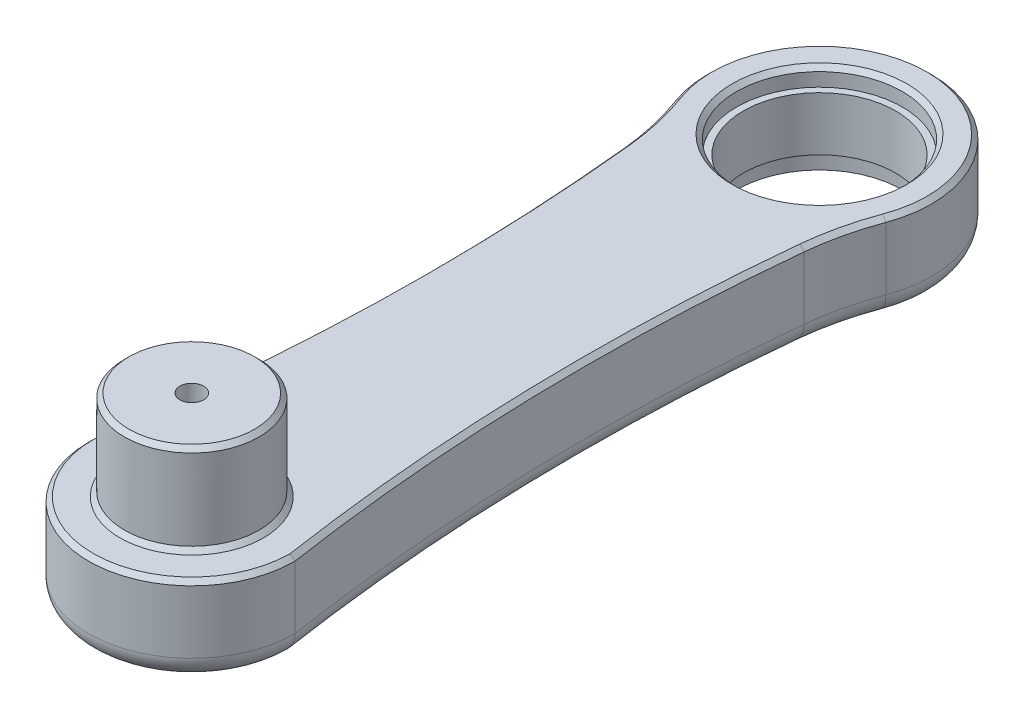
ISO-10303-21;
HEADER;
FILE_DESCRIPTION(('STEP AP214'),'2;1');
FILE_NAME('part.step','',(''),(''),'','','');
FILE_SCHEMA(('AUTOMOTIVE_DESIGN { 1 0 10303 214 1 1 1 1 }'));
ENDSEC;
DATA;
#1=APPLICATION_CONTEXT('core data for automotive mechanical design processes');
#2=APPLICATION_PROTOCOL_DEFINITION('international standard','automotive_design',2000,#1);
#3=PRODUCT_CONTEXT('',#1,'mechanical');
#4=PRODUCT('Part','Part','',(#3));
#5=PRODUCT_RELATED_PRODUCT_CATEGORY('part','',(#4));
#6=PRODUCT_DEFINITION_FORMATION('','',#4);
#7=PRODUCT_DEFINITION_CONTEXT('part definition',#1,'design');
#8=PRODUCT_DEFINITION('design','',#6,#7);
#9=PRODUCT_DEFINITION_SHAPE('','',#8);
#10=(LENGTH_UNIT() NAMED_UNIT(*) SI_UNIT(.MILLI.,.METRE.));
#11=(NAMED_UNIT(*) PLANE_ANGLE_UNIT() SI_UNIT($,.RADIAN.));
#12=(NAMED_UNIT(*) SI_UNIT($,.STERADIAN.) SOLID_ANGLE_UNIT());
#13=UNCERTAINTY_MEASURE_WITH_UNIT(LENGTH_MEASURE(1.E-05),#10,'distance_accuracy_value','');
#14=(GEOMETRIC_REPRESENTATION_CONTEXT(3) GLOBAL_UNCERTAINTY_ASSIGNED_CONTEXT((#13)) GLOBAL_UNIT_ASSIGNED_CONTEXT((#10,
#11,#12)) REPRESENTATION_CONTEXT('',''));
#15=CARTESIAN_POINT('',(0.,0.,0.));
#16=DIRECTION('',(0.,0.,1.));
#17=DIRECTION('',(1.,0.,0.));
#18=AXIS2_PLACEMENT_3D('',#15,#16,#17);
#19=CARTESIAN_POINT('',(0.,0.,-140.));
#20=DIRECTION('',(0.,1.,0.));
#21=DIRECTION('',(0.,0.,1.));
#22=AXIS2_PLACEMENT_3D('',#19,#20,#21);
#23=CYLINDRICAL_SURFACE('',#22,18.485);
#24=CARTESIAN_POINT('',(0.,0.,-140.));
#25=DIRECTION('',(0.,1.,0.));
#26=DIRECTION('',(0.,0.,1.));
#27=AXIS2_PLACEMENT_3D('',#24,#25,#26);
#28=CIRCLE('',#27,18.485);
#29=CARTESIAN_POINT('',(0.,0.,-121.515));
#30=VERTEX_POINT('',#29);
#31=EDGE_CURVE('E234',#30,#30,#28,.T.);
#32=ORIENTED_EDGE('',*,*,#31,.F.);
#33=EDGE_LOOP('',(#32));
#34=FACE_BOUND('',#33,.T.);
#35=CARTESIAN_POINT('',(0.,4.,-140.));
#36=DIRECTION('',(0.,1.,0.));
#37=DIRECTION('',(0.,0.,1.));
#38=AXIS2_PLACEMENT_3D('',#35,#36,#37);
#39=CIRCLE('',#38,18.485);
#40=CARTESIAN_POINT('',(0.,4.,-121.515));
#41=VERTEX_POINT('',#40);
#42=EDGE_CURVE('E11',#41,#41,#39,.F.);
#43=ORIENTED_EDGE('',*,*,#42,.F.);
#44=EDGE_LOOP('',(#43));
#45=FACE_BOUND('',#44,.T.);
#46=ADVANCED_FACE('F41',(#34,#45),#23,.F.);
#47=CARTESIAN_POINT('',(0.,0.,0.));
#48=DIRECTION('',(0.,1.,0.));
#49=DIRECTION('',(0.,0.,1.));
#50=AXIS2_PLACEMENT_3D('',#47,#48,#49);
#51=CYLINDRICAL_SURFACE('',#50,2.65);
#52=CARTESIAN_POINT('',(0.,40.,0.));
#53=DIRECTION('',(0.,1.,0.));
#54=DIRECTION('',(0.,0.,1.));
#55=AXIS2_PLACEMENT_3D('',#52,#53,#54);
#56=CIRCLE('',#55,2.65);
#57=CARTESIAN_POINT('',(0.,40.,2.65));
#58=VERTEX_POINT('',#57);
#59=EDGE_CURVE('E145',#58,#58,#56,.T.);
#60=ORIENTED_EDGE('',*,*,#59,.T.);
#61=EDGE_LOOP('',(#60));
#62=FACE_BOUND('',#61,.T.);
#63=CARTESIAN_POINT('',(0.,8.,0.));
#64=DIRECTION('',(0.,-1.,0.));
#65=DIRECTION('',(0.,0.,-1.));
#66=AXIS2_PLACEMENT_3D('',#63,#64,#65);
#67=CIRCLE('',#66,2.65);
#68=CARTESIAN_POINT('',(0.,8.,-2.65));
#69=VERTEX_POINT('',#68);
#70=EDGE_CURVE('E268',#69,#69,#67,.F.);
#71=ORIENTED_EDGE('',*,*,#70,.F.);
#72=EDGE_LOOP('',(#71));
#73=FACE_BOUND('',#72,.T.);
#74=ADVANCED_FACE('F386',(#62,#73),#51,.F.);
#75=CARTESIAN_POINT('',(79.7317394305135,20.,-110.540710677535));
#76=DIRECTION('',(0.,-1.,0.));
#77=DIRECTION('',(0.,0.,-1.));
#78=AXIS2_PLACEMENT_3D('',#75,#76,#77);
#79=CYLINDRICAL_SURFACE('',#78,60.);
#80=DIRECTION('',(0.,-1.,0.));
#81=VECTOR('',#80,1.);
#82=CARTESIAN_POINT('',(20.0338907014118,20.,-116.554599362678));
#83=LINE('',#82,#81);
#84=CARTESIAN_POINT('',(20.0338907014118,19.,-116.554599362678));
#85=VERTEX_POINT('',#84);
#86=CARTESIAN_POINT('',(20.0338907014118,5.,-116.554599362678));
#87=VERTEX_POINT('',#86);
#88=EDGE_CURVE('E336',#85,#87,#83,.T.);
#89=ORIENTED_EDGE('',*,*,#88,.T.);
#90=CARTESIAN_POINT('',(79.7317394305135,5.,-110.540710677535));
#91=DIRECTION('',(0.,-1.,0.));
#92=DIRECTION('',(0.,0.,-1.));
#93=AXIS2_PLACEMENT_3D('',#90,#91,#92);
#94=CIRCLE('',#93,60.);
#95=CARTESIAN_POINT('',(23.4505115972098,5.,-131.335503140452));
#96=VERTEX_POINT('',#95);
#97=EDGE_CURVE('E254',#87,#96,#94,.T.);
#98=ORIENTED_EDGE('',*,*,#97,.T.);
#99=DIRECTION('',(0.,-1.,0.));
#100=VECTOR('',#99,1.);
#101=CARTESIAN_POINT('',(23.4505115972098,20.,-131.335503140452));
#102=LINE('',#101,#100);
#103=CARTESIAN_POINT('',(23.4505115972098,19.,-131.335503140452));
#104=VERTEX_POINT('',#103);
#105=EDGE_CURVE('E348',#104,#96,#102,.T.);
#106=ORIENTED_EDGE('',*,*,#105,.F.);
#107=CARTESIAN_POINT('',(79.7317394305135,19.,-110.540710677535));
#108=DIRECTION('',(0.,-1.,0.));
#109=DIRECTION('',(0.,0.,-1.));
#110=AXIS2_PLACEMENT_3D('',#107,#108,#109);
#111=CIRCLE('',#110,60.);
#112=EDGE_CURVE('E176',#104,#85,#111,.F.);
#113=ORIENTED_EDGE('',*,*,#112,.T.);
#114=EDGE_LOOP('',(#89,#98,#106,#113));
#115=FACE_BOUND('',#114,.T.);
#116=ADVANCED_FACE('F394',(#115),#79,.F.);
#117=CARTESIAN_POINT('',(0.,20.,-140.));
#118=DIRECTION('',(0.,-1.,0.));
#119=DIRECTION('',(0.,0.,-1.));
#120=AXIS2_PLACEMENT_3D('',#117,#118,#119);
#121=CYLINDRICAL_SURFACE('',#120,25.);
#122=ORIENTED_EDGE('',*,*,#105,.T.);
#123=CARTESIAN_POINT('',(0.,5.,-140.));
#124=DIRECTION('',(0.,-1.,0.));
#125=DIRECTION('',(0.,0.,-1.));
#126=AXIS2_PLACEMENT_3D('',#123,#124,#125);
#127=CIRCLE('',#126,25.);
#128=CARTESIAN_POINT('',(-23.4505115972098,5.,-131.335503140451));
#129=VERTEX_POINT('',#128);
#130=EDGE_CURVE('E252',#96,#129,#127,.F.);
#131=ORIENTED_EDGE('',*,*,#130,.T.);
#132=DIRECTION('',(0.,-1.,0.));
#133=VECTOR('',#132,1.);
#134=CARTESIAN_POINT('',(-23.4505115972098,20.,-131.335503140451));
#135=LINE('',#134,#133);
#136=CARTESIAN_POINT('',(-23.4505115972098,19.,-131.335503140451));
#137=VERTEX_POINT('',#136);
#138=EDGE_CURVE('E345',#137,#129,#135,.T.);
#139=ORIENTED_EDGE('',*,*,#138,.F.);
#140=CARTESIAN_POINT('',(0.,19.,-140.));
#141=DIRECTION('',(0.,-1.,0.));
#142=DIRECTION('',(0.,0.,-1.));
#143=AXIS2_PLACEMENT_3D('',#140,#141,#142);
#144=CIRCLE('',#143,25.);
#145=EDGE_CURVE('E174',#137,#104,#144,.T.);
#146=ORIENTED_EDGE('',*,*,#145,.T.);
#147=EDGE_LOOP('',(#122,#131,#139,#146));
#148=FACE_BOUND('',#147,.T.);
#149=ADVANCED_FACE('F445',(#148),#121,.T.);
#150=CARTESIAN_POINT('',(-79.7317394305134,20.,-110.540710677535));
#151=DIRECTION('',(0.,-1.,0.));
#152=DIRECTION('',(0.,0.,-1.));
#153=AXIS2_PLACEMENT_3D('',#150,#151,#152);
#154=CYLINDRICAL_SURFACE('',#153,60.);
#155=ORIENTED_EDGE('',*,*,#138,.T.);
#156=CARTESIAN_POINT('',(-79.7317394305134,5.,-110.540710677535));
#157=DIRECTION('',(0.,-1.,0.));
#158=DIRECTION('',(0.,0.,-1.));
#159=AXIS2_PLACEMENT_3D('',#156,#157,#158);
#160=CIRCLE('',#159,60.);
#161=CARTESIAN_POINT('',(-20.0338907014117,5.,-116.554599362678));
#162=VERTEX_POINT('',#161);
#163=EDGE_CURVE('E250',#129,#162,#160,.T.);
#164=ORIENTED_EDGE('',*,*,#163,.T.);
#165=DIRECTION('',(0.,-1.,0.));
#166=VECTOR('',#165,1.);
#167=CARTESIAN_POINT('',(-20.0338907014117,20.,-116.554599362678));
#168=LINE('',#167,#166);
#169=CARTESIAN_POINT('',(-20.0338907014117,19.,-116.554599362678));
#170=VERTEX_POINT('',#169);
#171=EDGE_CURVE('E342',#170,#162,#168,.T.);
#172=ORIENTED_EDGE('',*,*,#171,.F.);
#173=CARTESIAN_POINT('',(-79.7317394305134,19.,-110.540710677535));
#174=DIRECTION('',(0.,-1.,0.));
#175=DIRECTION('',(0.,0.,-1.));
#176=AXIS2_PLACEMENT_3D('',#173,#174,#175);
#177=CIRCLE('',#176,60.);
#178=EDGE_CURVE('E172',#170,#137,#177,.F.);
#179=ORIENTED_EDGE('',*,*,#178,.T.);
#180=EDGE_LOOP('',(#155,#164,#172,#179));
#181=FACE_BOUND('',#180,.T.);
#182=ADVANCED_FACE('F382',(#181),#154,.F.);
#183=CARTESIAN_POINT('',(-482.165728502631,20.,-70.));
#184=DIRECTION('',(0.,-1.,0.));
#185=DIRECTION('',(0.,0.,-1.));
#186=AXIS2_PLACEMENT_3D('',#183,#184,#185);
#187=CYLINDRICAL_SURFACE('',#186,464.470845405125);
#188=ORIENTED_EDGE('',*,*,#171,.T.);
#189=CARTESIAN_POINT('',(-482.165728502631,5.,-70.));
#190=DIRECTION('',(0.,-1.,0.));
#191=DIRECTION('',(0.,0.,-1.));
#192=AXIS2_PLACEMENT_3D('',#189,#190,#191);
#193=CIRCLE('',#192,464.470845405125);
#194=CARTESIAN_POINT('',(-23.,5.,0.));
#195=VERTEX_POINT('',#194);
#196=EDGE_CURVE('E183',#162,#195,#193,.T.);
#197=ORIENTED_EDGE('',*,*,#196,.T.);
#198=DIRECTION('',(0.,-1.,0.));
#199=VECTOR('',#198,1.);
#200=CARTESIAN_POINT('',(-23.,20.,0.));
#201=LINE('',#200,#199);
#202=CARTESIAN_POINT('',(-23.,19.,0.));
#203=VERTEX_POINT('',#202);
#204=EDGE_CURVE('E340',#203,#195,#201,.T.);
#205=ORIENTED_EDGE('',*,*,#204,.F.);
#206=CARTESIAN_POINT('',(-482.165728502631,19.,-70.));
#207=DIRECTION('',(0.,-1.,0.));
#208=DIRECTION('',(0.,0.,-1.));
#209=AXIS2_PLACEMENT_3D('',#206,#207,#208);
#210=CIRCLE('',#209,464.470845405125);
#211=EDGE_CURVE('E170',#203,#170,#210,.F.);
#212=ORIENTED_EDGE('',*,*,#211,.T.);
#213=EDGE_LOOP('',(#188,#197,#205,#212));
#214=FACE_BOUND('',#213,.T.);
#215=ADVANCED_FACE('F375',(#214),#187,.F.);
#216=CARTESIAN_POINT('',(0.,20.,0.));
#217=DIRECTION('',(0.,-1.,0.));
#218=DIRECTION('',(0.,0.,-1.));
#219=AXIS2_PLACEMENT_3D('',#216,#217,#218);
#220=CYLINDRICAL_SURFACE('',#219,23.);
#221=ORIENTED_EDGE('',*,*,#204,.T.);
#222=CARTESIAN_POINT('',(0.,5.,0.));
#223=DIRECTION('',(0.,-1.,0.));
#224=DIRECTION('',(0.,0.,-1.));
#225=AXIS2_PLACEMENT_3D('',#222,#223,#224);
#226=CIRCLE('',#225,23.);
#227=CARTESIAN_POINT('',(22.9999999999999,5.,-1.2490009027033E-13));
#228=VERTEX_POINT('',#227);
#229=EDGE_CURVE('E57',#195,#228,#226,.F.);
#230=ORIENTED_EDGE('',*,*,#229,.T.);
#231=DIRECTION('',(0.,-1.,0.));
#232=VECTOR('',#231,1.);
#233=CARTESIAN_POINT('',(22.9999999999999,20.,-1.2490009027033E-13));
#234=LINE('',#233,#232);
#235=CARTESIAN_POINT('',(22.9999999999999,19.,-1.2490009027033E-13));
#236=VERTEX_POINT('',#235);
#237=EDGE_CURVE('E338',#236,#228,#234,.T.);
#238=ORIENTED_EDGE('',*,*,#237,.F.);
#239=CARTESIAN_POINT('',(0.,19.,0.));
#240=DIRECTION('',(0.,-1.,0.));
#241=DIRECTION('',(0.,0.,-1.));
#242=AXIS2_PLACEMENT_3D('',#239,#240,#241);
#243=CIRCLE('',#242,23.);
#244=EDGE_CURVE('E163',#236,#203,#243,.T.);
#245=ORIENTED_EDGE('',*,*,#244,.T.);
#246=EDGE_LOOP('',(#221,#230,#238,#245));
#247=FACE_BOUND('',#246,.T.);
#248=ADVANCED_FACE('F373',(#247),#220,.T.);
#249=CARTESIAN_POINT('',(482.165728502631,20.,-70.));
#250=DIRECTION('',(0.,-1.,0.));
#251=DIRECTION('',(0.,0.,-1.));
#252=AXIS2_PLACEMENT_3D('',#249,#250,#251);
#253=CYLINDRICAL_SURFACE('',#252,464.470845405125);
#254=ORIENTED_EDGE('',*,*,#237,.T.);
#255=CARTESIAN_POINT('',(482.165728502631,5.,-70.));
#256=DIRECTION('',(0.,-1.,0.));
#257=DIRECTION('',(0.,0.,-1.));
#258=AXIS2_PLACEMENT_3D('',#255,#256,#257);
#259=CIRCLE('',#258,464.470845405125);
#260=EDGE_CURVE('E64',#228,#87,#259,.T.);
#261=ORIENTED_EDGE('',*,*,#260,.T.);
#262=ORIENTED_EDGE('',*,*,#88,.F.);
#263=CARTESIAN_POINT('',(482.165728502631,19.,-70.));
#264=DIRECTION('',(0.,-1.,0.));
#265=DIRECTION('',(0.,0.,-1.));
#266=AXIS2_PLACEMENT_3D('',#263,#264,#265);
#267=CIRCLE('',#266,464.470845405125);
#268=EDGE_CURVE('E141',#85,#236,#267,.F.);
#269=ORIENTED_EDGE('',*,*,#268,.T.);
#270=EDGE_LOOP('',(#254,#261,#262,#269));
#271=FACE_BOUND('',#270,.T.);
#272=ADVANCED_FACE('F372',(#271),#253,.F.);
#273=CARTESIAN_POINT('',(39.8658697152567,20.,-125.270355338768));
#274=DIRECTION('',(0.,-1.,0.));
#275=DIRECTION('',(0.,0.,-1.));
#276=AXIS2_PLACEMENT_3D('',#273,#274,#275);
#277=PLANE('',#276);
#278=CARTESIAN_POINT('',(0.,20.,0.));
#279=DIRECTION('',(0.,-1.,0.));
#280=DIRECTION('',(0.,0.,-1.));
#281=AXIS2_PLACEMENT_3D('',#278,#279,#280);
#282=CIRCLE('',#281,22.);
#283=CARTESIAN_POINT('',(-21.9998724689642,20.,0.0749089401107759));
#284=VERTEX_POINT('',#283);
#285=CARTESIAN_POINT('',(21.9998724689643,20.,0.0749089401108745));
#286=VERTEX_POINT('',#285);
#287=EDGE_CURVE('E160',#284,#286,#282,.F.);
#288=ORIENTED_EDGE('',*,*,#287,.T.);
#289=CARTESIAN_POINT('',(482.165728502631,20.,-70.));
#290=DIRECTION('',(0.,-1.,0.));
#291=DIRECTION('',(0.,0.,-1.));
#292=AXIS2_PLACEMENT_3D('',#289,#290,#291);
#293=CIRCLE('',#292,465.470845405125);
#294=CARTESIAN_POINT('',(19.0389265559268,20.,-116.654830840764));
#295=VERTEX_POINT('',#294);
#296=EDGE_CURVE('E139',#286,#295,#293,.T.);
#297=ORIENTED_EDGE('',*,*,#296,.T.);
#298=CARTESIAN_POINT('',(79.7317394305135,20.,-110.540710677535));
#299=DIRECTION('',(0.,-1.,0.));
#300=DIRECTION('',(0.,0.,-1.));
#301=AXIS2_PLACEMENT_3D('',#298,#299,#300);
#302=CIRCLE('',#301,61.);
#303=CARTESIAN_POINT('',(22.5124911333215,20.,-131.682083014833));
#304=VERTEX_POINT('',#303);
#305=EDGE_CURVE('E148',#295,#304,#302,.T.);
#306=ORIENTED_EDGE('',*,*,#305,.T.);
#307=CARTESIAN_POINT('',(0.,20.,-140.));
#308=DIRECTION('',(0.,-1.,0.));
#309=DIRECTION('',(0.,0.,-1.));
#310=AXIS2_PLACEMENT_3D('',#307,#308,#309);
#311=CIRCLE('',#310,24.);
#312=CARTESIAN_POINT('',(-22.5124911333214,20.,-131.682083014833));
#313=VERTEX_POINT('',#312);
#314=EDGE_CURVE('E154',#304,#313,#311,.F.);
#315=ORIENTED_EDGE('',*,*,#314,.T.);
#316=CARTESIAN_POINT('',(-79.7317394305134,20.,-110.540710677535));
#317=DIRECTION('',(0.,-1.,0.));
#318=DIRECTION('',(0.,0.,-1.));
#319=AXIS2_PLACEMENT_3D('',#316,#317,#318);
#320=CIRCLE('',#319,61.);
#321=CARTESIAN_POINT('',(-19.0389265559267,20.,-116.654830840764));
#322=VERTEX_POINT('',#321);
#323=EDGE_CURVE('E363',#313,#322,#320,.T.);
#324=ORIENTED_EDGE('',*,*,#323,.T.);
#325=CARTESIAN_POINT('',(-482.165728502631,20.,-70.));
#326=DIRECTION('',(0.,-1.,0.));
#327=DIRECTION('',(0.,0.,-1.));
#328=AXIS2_PLACEMENT_3D('',#325,#326,#327);
#329=CIRCLE('',#328,465.470845405125);
#330=EDGE_CURVE('E165',#322,#284,#329,.T.);
#331=ORIENTED_EDGE('',*,*,#330,.T.);
#332=EDGE_LOOP('',(#288,#297,#306,#315,#324,#331));
#333=FACE_BOUND('',#332,.T.);
#334=CARTESIAN_POINT('',(0.,20.,0.));
#335=DIRECTION('',(0.,-1.,0.));
#336=DIRECTION('',(0.,0.,-1.));
#337=AXIS2_PLACEMENT_3D('',#334,#335,#336);
#338=CIRCLE('',#337,16.01);
#339=CARTESIAN_POINT('',(0.,20.,-16.01));
#340=VERTEX_POINT('',#339);
#341=EDGE_CURVE('E155',#340,#340,#338,.T.);
#342=ORIENTED_EDGE('',*,*,#341,.T.);
#343=EDGE_LOOP('',(#342));
#344=FACE_BOUND('',#343,.T.);
#345=CARTESIAN_POINT('',(0.,20.,-140.));
#346=DIRECTION('',(0.,-1.,0.));
#347=DIRECTION('',(0.,0.,-1.));
#348=AXIS2_PLACEMENT_3D('',#345,#346,#347);
#349=CIRCLE('',#348,19.485);
#350=CARTESIAN_POINT('',(0.,20.,-159.485));
#351=VERTEX_POINT('',#350);
#352=EDGE_CURVE('E357',#351,#351,#349,.T.);
#353=ORIENTED_EDGE('',*,*,#352,.T.);
#354=EDGE_LOOP('',(#353));
#355=FACE_BOUND('',#354,.T.);
#356=ADVANCED_FACE('F157',(#333,#344,#355),#277,.F.);
#357=CARTESIAN_POINT('',(39.8658697152567,0.,-125.270355338768));
#358=DIRECTION('',(0.,-1.,0.));
#359=DIRECTION('',(0.,0.,-1.));
#360=AXIS2_PLACEMENT_3D('',#357,#358,#359);
#361=PLANE('',#360);
#362=CARTESIAN_POINT('',(0.,0.,0.));
#363=DIRECTION('',(0.,-1.,0.));
#364=DIRECTION('',(0.,0.,-1.));
#365=AXIS2_PLACEMENT_3D('',#362,#363,#364);
#366=CIRCLE('',#365,4.15000000000001);
#367=CARTESIAN_POINT('',(0.,0.,-4.15000000000001));
#368=VERTEX_POINT('',#367);
#369=EDGE_CURVE('E50',#368,#368,#366,.F.);
#370=ORIENTED_EDGE('',*,*,#369,.T.);
#371=EDGE_LOOP('',(#370));
#372=FACE_BOUND('',#371,.T.);
#373=CARTESIAN_POINT('',(0.,0.,0.));
#374=DIRECTION('',(0.,-1.,0.));
#375=DIRECTION('',(0.,0.,-1.));
#376=AXIS2_PLACEMENT_3D('',#373,#374,#375);
#377=CIRCLE('',#376,18.);
#378=CARTESIAN_POINT('',(17.9965020642617,0.,0.354842853985803));
#379=VERTEX_POINT('',#378);
#380=CARTESIAN_POINT('',(-17.9965020642617,0.,0.354842853985715));
#381=VERTEX_POINT('',#380);
#382=EDGE_CURVE('E239',#379,#381,#377,.T.);
#383=ORIENTED_EDGE('',*,*,#382,.T.);
#384=CARTESIAN_POINT('',(-482.165728502631,0.,-70.));
#385=DIRECTION('',(0.,-1.,0.));
#386=DIRECTION('',(0.,0.,-1.));
#387=AXIS2_PLACEMENT_3D('',#384,#385,#386);
#388=CIRCLE('',#387,469.470845405125);
#389=CARTESIAN_POINT('',(-15.0590699739866,0.,-117.055756753106));
#390=VERTEX_POINT('',#389);
#391=EDGE_CURVE('E247',#381,#390,#388,.F.);
#392=ORIENTED_EDGE('',*,*,#391,.T.);
#393=CARTESIAN_POINT('',(-79.7317394305134,0.,-110.540710677535));
#394=DIRECTION('',(0.,-1.,0.));
#395=DIRECTION('',(0.,0.,-1.));
#396=AXIS2_PLACEMENT_3D('',#393,#394,#395);
#397=CIRCLE('',#396,65.);
#398=CARTESIAN_POINT('',(-18.7604092777678,0.,-133.068402512361));
#399=VERTEX_POINT('',#398);
#400=EDGE_CURVE('E245',#390,#399,#397,.F.);
#401=ORIENTED_EDGE('',*,*,#400,.T.);
#402=CARTESIAN_POINT('',(0.,0.,-140.));
#403=DIRECTION('',(0.,-1.,0.));
#404=DIRECTION('',(0.,0.,-1.));
#405=AXIS2_PLACEMENT_3D('',#402,#403,#404);
#406=CIRCLE('',#405,20.);
#407=CARTESIAN_POINT('',(18.7604092777679,0.,-133.068402512361));
#408=VERTEX_POINT('',#407);
#409=EDGE_CURVE('E243',#399,#408,#406,.T.);
#410=ORIENTED_EDGE('',*,*,#409,.T.);
#411=CARTESIAN_POINT('',(79.7317394305135,0.,-110.540710677535));
#412=DIRECTION('',(0.,-1.,0.));
#413=DIRECTION('',(0.,0.,-1.));
#414=AXIS2_PLACEMENT_3D('',#411,#412,#413);
#415=CIRCLE('',#414,65.);
#416=CARTESIAN_POINT('',(15.0590699739866,0.,-117.055756753107));
#417=VERTEX_POINT('',#416);
#418=EDGE_CURVE('E241',#408,#417,#415,.F.);
#419=ORIENTED_EDGE('',*,*,#418,.T.);
#420=CARTESIAN_POINT('',(482.165728502631,0.,-70.));
#421=DIRECTION('',(0.,-1.,0.));
#422=DIRECTION('',(0.,0.,-1.));
#423=AXIS2_PLACEMENT_3D('',#420,#421,#422);
#424=CIRCLE('',#423,469.470845405125);
#425=EDGE_CURVE('E237',#417,#379,#424,.F.);
#426=ORIENTED_EDGE('',*,*,#425,.T.);
#427=EDGE_LOOP('',(#383,#392,#401,#410,#419,#426));
#428=FACE_BOUND('',#427,.T.);
#429=ORIENTED_EDGE('',*,*,#31,.T.);
#430=EDGE_LOOP('',(#429));
#431=FACE_BOUND('',#430,.T.);
#432=ADVANCED_FACE('F310',(#372,#428,#431),#361,.T.);
#433=CARTESIAN_POINT('',(0.,40.,0.));
#434=DIRECTION('',(0.,-1.,0.));
#435=DIRECTION('',(0.,0.,-1.));
#436=AXIS2_PLACEMENT_3D('',#433,#434,#435);
#437=CYLINDRICAL_SURFACE('',#436,15.01);
#438=CARTESIAN_POINT('',(0.,21.,0.));
#439=DIRECTION('',(0.,-1.,0.));
#440=DIRECTION('',(0.,0.,-1.));
#441=AXIS2_PLACEMENT_3D('',#438,#439,#440);
#442=CIRCLE('',#441,15.01);
#443=CARTESIAN_POINT('',(0.,21.,-15.01));
#444=VERTEX_POINT('',#443);
#445=EDGE_CURVE('E178',#444,#444,#442,.F.);
#446=ORIENTED_EDGE('',*,*,#445,.T.);
#447=EDGE_LOOP('',(#446));
#448=FACE_BOUND('',#447,.T.);
#449=CARTESIAN_POINT('',(0.,39.,0.));
#450=DIRECTION('',(0.,1.,0.));
#451=DIRECTION('',(0.,0.,1.));
#452=AXIS2_PLACEMENT_3D('',#449,#450,#451);
#453=CIRCLE('',#452,15.01);
#454=CARTESIAN_POINT('',(0.,39.,15.01));
#455=VERTEX_POINT('',#454);
#456=EDGE_CURVE('E354',#455,#455,#453,.F.);
#457=ORIENTED_EDGE('',*,*,#456,.T.);
#458=EDGE_LOOP('',(#457));
#459=FACE_BOUND('',#458,.T.);
#460=ADVANCED_FACE('F531',(#448,#459),#437,.T.);
#461=CARTESIAN_POINT('',(0.,40.,0.));
#462=DIRECTION('',(0.,1.,0.));
#463=DIRECTION('',(0.,0.,1.));
#464=AXIS2_PLACEMENT_3D('',#461,#462,#463);
#465=PLANE('',#464);
#466=ORIENTED_EDGE('',*,*,#59,.F.);
#467=EDGE_LOOP('',(#466));
#468=FACE_BOUND('',#467,.T.);
#469=CARTESIAN_POINT('',(0.,40.,0.));
#470=DIRECTION('',(0.,1.,0.));
#471=DIRECTION('',(0.,0.,1.));
#472=AXIS2_PLACEMENT_3D('',#469,#470,#471);
#473=CIRCLE('',#472,14.01);
#474=CARTESIAN_POINT('',(0.,40.,14.01));
#475=VERTEX_POINT('',#474);
#476=EDGE_CURVE('E351',#475,#475,#473,.T.);
#477=ORIENTED_EDGE('',*,*,#476,.T.);
#478=EDGE_LOOP('',(#477));
#479=FACE_BOUND('',#478,.T.);
#480=ADVANCED_FACE('F408',(#468,#479),#465,.T.);
#481=CARTESIAN_POINT('',(0.,40.,0.));
#482=DIRECTION('',(0.,-1.,0.));
#483=DIRECTION('',(0.,0.,-1.));
#484=AXIS2_PLACEMENT_3D('',#481,#482,#483);
#485=CONICAL_SURFACE('',#484,14.01,0.785398163397436);
#486=ORIENTED_EDGE('',*,*,#456,.F.);
#487=EDGE_LOOP('',(#486));
#488=FACE_BOUND('',#487,.T.);
#489=ORIENTED_EDGE('',*,*,#476,.F.);
#490=EDGE_LOOP('',(#489));
#491=FACE_BOUND('',#490,.T.);
#492=ADVANCED_FACE('F400',(#488,#491),#485,.T.);
#493=CARTESIAN_POINT('',(0.,16.,-140.));
#494=DIRECTION('',(0.,1.,0.));
#495=DIRECTION('',(0.,0.,1.));
#496=AXIS2_PLACEMENT_3D('',#493,#494,#495);
#497=CIRCLE('',#496,18.485);
#498=CARTESIAN_POINT('',(0.,16.,-121.515));
#499=VERTEX_POINT('',#498);
#500=EDGE_CURVE('E328',#499,#499,#497,.T.);
#501=ORIENTED_EDGE('',*,*,#500,.F.);
#502=EDGE_LOOP('',(#501));
#503=FACE_BOUND('',#502,.T.);
#504=CARTESIAN_POINT('',(0.,19.,-140.));
#505=DIRECTION('',(0.,-1.,0.));
#506=DIRECTION('',(0.,0.,-1.));
#507=AXIS2_PLACEMENT_3D('',#504,#505,#506);
#508=CIRCLE('',#507,18.485);
#509=CARTESIAN_POINT('',(0.,19.,-158.485));
#510=VERTEX_POINT('',#509);
#511=EDGE_CURVE('E181',#510,#510,#508,.F.);
#512=ORIENTED_EDGE('',*,*,#511,.T.);
#513=EDGE_LOOP('',(#512));
#514=FACE_BOUND('',#513,.T.);
#515=ADVANCED_FACE('F389',(#503,#514),#23,.F.);
#516=CARTESIAN_POINT('',(-79.7317394305134,20.,-110.540710677535));
#517=DIRECTION('',(0.,1.,0.));
#518=DIRECTION('',(0.,0.,1.));
#519=AXIS2_PLACEMENT_3D('',#516,#517,#518);
#520=CONICAL_SURFACE('',#519,61.,0.785398163397438);
#521=DIRECTION('',(0.663280630907225,0.707106781186556,-0.245068979398254));
#522=VECTOR('',#521,1.);
#523=CARTESIAN_POINT('',(-23.4505115972098,19.,-131.335503140451));
#524=LINE('',#523,#522);
#525=EDGE_CURVE('E228',#137,#313,#524,.T.);
#526=ORIENTED_EDGE('',*,*,#525,.F.);
#527=ORIENTED_EDGE('',*,*,#178,.F.);
#528=DIRECTION('',(-0.703545894309934,-0.707106781186555,0.0708743578427609));
#529=VECTOR('',#528,1.);
#530=CARTESIAN_POINT('',(-19.0389265559267,20.,-116.654830840764));
#531=LINE('',#530,#529);
#532=EDGE_CURVE('E231',#322,#170,#531,.T.);
#533=ORIENTED_EDGE('',*,*,#532,.F.);
#534=ORIENTED_EDGE('',*,*,#323,.F.);
#535=EDGE_LOOP('',(#526,#527,#533,#534));
#536=FACE_BOUND('',#535,.T.);
#537=ADVANCED_FACE('F218',(#536),#520,.F.);
#538=CARTESIAN_POINT('',(-482.165728502631,20.,-70.));
#539=DIRECTION('',(0.,1.,0.));
#540=DIRECTION('',(0.,0.,1.));
#541=AXIS2_PLACEMENT_3D('',#538,#539,#540);
#542=CONICAL_SURFACE('',#541,465.470845405125,0.785398163397445);
#543=ORIENTED_EDGE('',*,*,#532,.T.);
#544=ORIENTED_EDGE('',*,*,#211,.F.);
#545=CARTESIAN_POINT('',(-23.,19.,0.));
#546=CARTESIAN_POINT('',(-22.833328374255,19.1666718511653,0.0126331763559206));
#547=CARTESIAN_POINT('',(-22.6666486006392,19.3333411099049,0.0251921761967329));
#548=CARTESIAN_POINT('',(-22.3332727569607,19.6666744432383,0.0501618229009855));
#549=CARTESIAN_POINT('',(-22.1665766868979,19.833338517832,0.0625724697637979));
#550=CARTESIAN_POINT('',(-21.9998724689643,20.,0.0749089401108717));
#551=B_SPLINE_CURVE_WITH_KNOTS('',3,(#545,#546,#547,#548,#549,#550),.UNSPECIFIED.,.F.,.F.,(4,2,
4),(0.,0.708143103451322,1.41628620990026),.UNSPECIFIED.);
#552=EDGE_CURVE('E221',#284,#203,#551,.F.);
#553=ORIENTED_EDGE('',*,*,#552,.F.);
#554=ORIENTED_EDGE('',*,*,#330,.F.);
#555=EDGE_LOOP('',(#543,#544,#553,#554));
#556=FACE_BOUND('',#555,.T.);
#557=ADVANCED_FACE('F210',(#556),#542,.F.);
#558=CARTESIAN_POINT('',(0.,20.,-140.));
#559=DIRECTION('',(0.,-1.,0.));
#560=DIRECTION('',(0.,0.,-1.));
#561=AXIS2_PLACEMENT_3D('',#558,#559,#560);
#562=CONICAL_SURFACE('',#561,24.,0.785398163397436);
#563=ORIENTED_EDGE('',*,*,#525,.T.);
#564=ORIENTED_EDGE('',*,*,#314,.F.);
#565=DIRECTION('',(-0.663280630907225,0.707106781186556,-0.245068979398254));
#566=VECTOR('',#565,1.);
#567=CARTESIAN_POINT('',(23.4505115972098,19.,-131.335503140452));
#568=LINE('',#567,#566);
#569=EDGE_CURVE('E151',#104,#304,#568,.T.);
#570=ORIENTED_EDGE('',*,*,#569,.F.);
#571=ORIENTED_EDGE('',*,*,#145,.F.);
#572=EDGE_LOOP('',(#563,#564,#570,#571));
#573=FACE_BOUND('',#572,.T.);
#574=ADVANCED_FACE('F217',(#573),#562,.T.);
#575=CARTESIAN_POINT('',(0.,20.,0.));
#576=DIRECTION('',(0.,-1.,0.));
#577=DIRECTION('',(0.,0.,-1.));
#578=AXIS2_PLACEMENT_3D('',#575,#576,#577);
#579=CONICAL_SURFACE('',#578,22.,0.785398163397436);
#580=ORIENTED_EDGE('',*,*,#552,.T.);
#581=ORIENTED_EDGE('',*,*,#244,.F.);
#582=CARTESIAN_POINT('',(22.9999999999999,19.,-1.2490009027033E-13));
#583=CARTESIAN_POINT('',(22.8333283742549,19.1666718511653,0.01263317635586));
#584=CARTESIAN_POINT('',(22.6666486006392,19.3333411099049,0.0251921761967274));
#585=CARTESIAN_POINT('',(22.3332727569607,19.6666744432383,0.0501618229010765));
#586=CARTESIAN_POINT('',(22.1665766868979,19.833338517832,0.0625724697639301));
#587=CARTESIAN_POINT('',(21.9998724689643,20.,0.0749089401110383));
#588=B_SPLINE_CURVE_WITH_KNOTS('',3,(#582,#583,#584,#585,#586,#587),.UNSPECIFIED.,.F.,.F.,(4,2,
4),(0.,0.708143103451318,1.41628620990025),.UNSPECIFIED.);
#589=EDGE_CURVE('E144',#286,#236,#588,.F.);
#590=ORIENTED_EDGE('',*,*,#589,.F.);
#591=ORIENTED_EDGE('',*,*,#287,.F.);
#592=EDGE_LOOP('',(#580,#581,#590,#591));
#593=FACE_BOUND('',#592,.T.);
#594=ADVANCED_FACE('F194',(#593),#579,.T.);
#595=CARTESIAN_POINT('',(79.7317394305135,20.,-110.540710677535));
#596=DIRECTION('',(0.,1.,0.));
#597=DIRECTION('',(0.,0.,1.));
#598=AXIS2_PLACEMENT_3D('',#595,#596,#597);
#599=CONICAL_SURFACE('',#598,61.,0.785398163397438);
#600=ORIENTED_EDGE('',*,*,#569,.T.);
#601=ORIENTED_EDGE('',*,*,#305,.F.);
#602=DIRECTION('',(-0.703545894309937,0.707106781186553,-0.0708743578427607));
#603=VECTOR('',#602,1.);
#604=CARTESIAN_POINT('',(20.0338907014118,19.,-116.554599362678));
#605=LINE('',#604,#603);
#606=EDGE_CURVE('E135',#85,#295,#605,.T.);
#607=ORIENTED_EDGE('',*,*,#606,.F.);
#608=ORIENTED_EDGE('',*,*,#112,.F.);
#609=EDGE_LOOP('',(#600,#601,#607,#608));
#610=FACE_BOUND('',#609,.T.);
#611=ADVANCED_FACE('F149',(#610),#599,.F.);
#612=CARTESIAN_POINT('',(482.165728502631,20.,-70.));
#613=DIRECTION('',(0.,1.,0.));
#614=DIRECTION('',(0.,0.,1.));
#615=AXIS2_PLACEMENT_3D('',#612,#613,#614);
#616=CONICAL_SURFACE('',#615,465.470845405125,0.785398163397445);
#617=ORIENTED_EDGE('',*,*,#589,.T.);
#618=ORIENTED_EDGE('',*,*,#268,.F.);
#619=ORIENTED_EDGE('',*,*,#606,.T.);
#620=ORIENTED_EDGE('',*,*,#296,.F.);
#621=EDGE_LOOP('',(#617,#618,#619,#620));
#622=FACE_BOUND('',#621,.T.);
#623=ADVANCED_FACE('F137',(#622),#616,.F.);
#624=CARTESIAN_POINT('',(0.,21.,0.));
#625=DIRECTION('',(0.,-1.,0.));
#626=DIRECTION('',(0.,0.,-1.));
#627=AXIS2_PLACEMENT_3D('',#624,#625,#626);
#628=CONICAL_SURFACE('',#627,15.01,0.785398163397457);
#629=ORIENTED_EDGE('',*,*,#341,.F.);
#630=EDGE_LOOP('',(#629));
#631=FACE_BOUND('',#630,.T.);
#632=ORIENTED_EDGE('',*,*,#445,.F.);
#633=EDGE_LOOP('',(#632));
#634=FACE_BOUND('',#633,.T.);
#635=ADVANCED_FACE('F204',(#631,#634),#628,.T.);
#636=CARTESIAN_POINT('',(0.,19.,-140.));
#637=DIRECTION('',(0.,1.,0.));
#638=DIRECTION('',(0.,0.,1.));
#639=AXIS2_PLACEMENT_3D('',#636,#637,#638);
#640=CONICAL_SURFACE('',#639,18.485,0.785398163397443);
#641=ORIENTED_EDGE('',*,*,#352,.F.);
#642=EDGE_LOOP('',(#641));
#643=FACE_BOUND('',#642,.T.);
#644=ORIENTED_EDGE('',*,*,#511,.F.);
#645=EDGE_LOOP('',(#644));
#646=FACE_BOUND('',#645,.T.);
#647=ADVANCED_FACE('F415',(#643,#646),#640,.F.);
#648=CARTESIAN_POINT('',(79.7317394305135,5.,-110.540710677535));
#649=DIRECTION('',(0.,-1.,0.));
#650=DIRECTION('',(0.,0.,-1.));
#651=AXIS2_PLACEMENT_3D('',#648,#649,#650);
#652=TOROIDAL_SURFACE('',#651,65.,5.);
#653=CARTESIAN_POINT('',(15.0590699739866,5.,-117.055756753107));
#654=DIRECTION('',(-0.100231478085719,0.,0.994964145485028));
#655=DIRECTION('',(0.994964145485028,0.,0.100231478085719));
#656=AXIS2_PLACEMENT_3D('',#653,#654,#655);
#657=CIRCLE('',#656,5.);
#658=EDGE_CURVE('E297',#417,#87,#657,.T.);
#659=ORIENTED_EDGE('',*,*,#658,.F.);
#660=ORIENTED_EDGE('',*,*,#418,.F.);
#661=CARTESIAN_POINT('',(18.7604092777679,5.,-133.068402512361));
#662=DIRECTION('',(0.346579874381942,0.,-0.938020463888394));
#663=DIRECTION('',(-0.938020463888394,0.,-0.346579874381942));
#664=AXIS2_PLACEMENT_3D('',#661,#662,#663);
#665=CIRCLE('',#664,5.);
#666=EDGE_CURVE('E300',#96,#408,#665,.T.);
#667=ORIENTED_EDGE('',*,*,#666,.F.);
#668=ORIENTED_EDGE('',*,*,#97,.F.);
#669=EDGE_LOOP('',(#659,#660,#667,#668));
#670=FACE_BOUND('',#669,.T.);
#671=ADVANCED_FACE('F417',(#670),#652,.T.);
#672=CARTESIAN_POINT('',(0.,5.,-140.));
#673=DIRECTION('',(0.,-1.,0.));
#674=DIRECTION('',(0.,0.,-1.));
#675=AXIS2_PLACEMENT_3D('',#672,#673,#674);
#676=TOROIDAL_SURFACE('',#675,20.,5.);
#677=ORIENTED_EDGE('',*,*,#666,.T.);
#678=ORIENTED_EDGE('',*,*,#409,.F.);
#679=CARTESIAN_POINT('',(-18.7604092777679,5.,-133.068402512361));
#680=DIRECTION('',(0.346579874381942,0.,0.938020463888394));
#681=DIRECTION('',(0.938020463888394,0.,-0.346579874381942));
#682=AXIS2_PLACEMENT_3D('',#679,#680,#681);
#683=CIRCLE('',#682,5.);
#684=EDGE_CURVE('E294',#129,#399,#683,.T.);
#685=ORIENTED_EDGE('',*,*,#684,.F.);
#686=ORIENTED_EDGE('',*,*,#130,.F.);
#687=EDGE_LOOP('',(#677,#678,#685,#686));
#688=FACE_BOUND('',#687,.T.);
#689=ADVANCED_FACE('F284',(#688),#676,.T.);
#690=CARTESIAN_POINT('',(482.165728502631,5.,-70.));
#691=DIRECTION('',(0.,-1.,0.));
#692=DIRECTION('',(0.,0.,-1.));
#693=AXIS2_PLACEMENT_3D('',#690,#691,#692);
#694=TOROIDAL_SURFACE('',#693,469.470845405125,5.);
#695=ORIENTED_EDGE('',*,*,#658,.T.);
#696=ORIENTED_EDGE('',*,*,#260,.F.);
#697=CARTESIAN_POINT('',(22.9999999999999,5.,-1.2490009027033E-13));
#698=CARTESIAN_POINT('',(23.0000152701209,4.85967578545601,-1.54724037407213E-06));
#699=CARTESIAN_POINT('',(22.9940933780411,4.7193538774575,0.00044763313441504));
#700=CARTESIAN_POINT('',(22.9704856383898,4.4397160016679,0.00223628491039502));
#701=CARTESIAN_POINT('',(22.952800414511,4.30039998094044,0.00357570911079555));
#702=CARTESIAN_POINT('',(22.9057943755299,4.02386611048724,0.00713232330796196));
#703=CARTESIAN_POINT('',(22.8764824870557,3.88664673475948,0.00934883989461075));
#704=CARTESIAN_POINT('',(22.8064392200786,3.61517287534606,0.0146378407741504));
#705=CARTESIAN_POINT('',(22.7657079695631,3.48091835844868,0.0177103154735279));
#706=CARTESIAN_POINT('',(22.6731049978302,3.21628942175729,0.0246828654782253));
#707=CARTESIAN_POINT('',(22.6212302640643,3.08591606207524,0.0285831645756131));
#708=CARTESIAN_POINT('',(22.5066988628813,2.82996405526028,0.0371751670402592));
#709=CARTESIAN_POINT('',(22.4440382321304,2.70438719142423,0.041867161307467));
#710=CARTESIAN_POINT('',(22.308436714146,2.45903764502551,0.0519940510785394));
#711=CARTESIAN_POINT('',(22.2355017069557,2.33926169491307,0.0574285216087164));
#712=CARTESIAN_POINT('',(22.0798194116823,2.10624141260337,0.0689931183884544));
#713=CARTESIAN_POINT('',(21.9970687154554,1.9929993694751,0.075123486231296));
#714=CARTESIAN_POINT('',(21.8222824227574,1.77378333551741,0.0880270896596019));
#715=CARTESIAN_POINT('',(21.7302379582909,1.66781645160986,0.09480093887512));
#716=CARTESIAN_POINT('',(21.5375878198206,1.46401517688657,0.108923454804259));
#717=CARTESIAN_POINT('',(21.4369821215831,1.36618080909269,0.116272123144988));
#718=CARTESIAN_POINT('',(21.2278761189176,1.17928529646721,0.131480189088416));
#719=CARTESIAN_POINT('',(21.1193720468032,1.09022838697831,0.139339830242015));
#720=CARTESIAN_POINT('',(20.8953223309447,0.92159243519671,0.155492228426919));
#721=CARTESIAN_POINT('',(20.7797791115083,0.842010157391571,0.163784836203837));
#722=CARTESIAN_POINT('',(20.5420432532876,0.692594610178674,0.180759177346497));
#723=CARTESIAN_POINT('',(20.4198298853358,0.62279445656822,0.189442107039295));
#724=CARTESIAN_POINT('',(20.1700206782884,0.493766561004261,0.207090849057964));
#725=CARTESIAN_POINT('',(20.0424267919727,0.434535023468667,0.216056558460347));
#726=CARTESIAN_POINT('',(19.782771094383,0.327046078559464,0.234191889378828));
#727=CARTESIAN_POINT('',(19.6507111397867,0.278784173673785,0.243361425627665));
#728=CARTESIAN_POINT('',(19.3830549525163,0.193549912763851,0.261826232363853));
#729=CARTESIAN_POINT('',(19.2474597271425,0.156574378272995,0.271121466680621));
#730=CARTESIAN_POINT('',(18.9334363991081,0.0849819842628193,0.292500427193146));
#731=CARTESIAN_POINT('',(18.7541157115375,0.0542414954979761,0.304601980431369));
#732=CARTESIAN_POINT('',(18.3934403713149,0.0124460293420343,0.328709726603088));
#733=CARTESIAN_POINT('',(18.2120896287697,0.00135816415840606,0.340716045314935));
#734=CARTESIAN_POINT('',(18.0193649906754,3.90192856906649E-05,0.353346014593864));
#735=CARTESIAN_POINT('',(18.0079332587822,-7.45433116331307E-08,0.354094694903341));
#736=CARTESIAN_POINT('',(17.9965020642617,0.,0.354842853985414));
#737=B_SPLINE_CURVE_WITH_KNOTS('',3,(#697,#698,#699,#700,#701,#702,#703,#704,#705,#706,#707,
#708,#709,#710,#711,#712,#713,#714,#715,#716,#717,#718,#719,#720,#721,#722,#723,#724,#725,#726,
#727,#728,#729,#730,#731,#732,#733,#734,#735,#736),.UNSPECIFIED.,.F.,.F.,(4,2,2,2,2,2,2,2,2,2,2,
2,2,2,2,2,2,2,2,4),(0.,0.420843744651638,0.841665177918067,1.26216413971096,1.68265838877312,
2.1032664583636,2.52402941380277,2.94455253685759,3.36522210116907,3.7862969259448,
4.20737294267635,4.62865115446953,5.04978508787588,5.47231193640767,5.89468673309881,
6.31688804392772,6.73897034452804,7.28491527484566,7.82994572489919,7.8643142828797),.UNSPECIFIED.);
#738=EDGE_CURVE('E287',#379,#228,#737,.F.);
#739=ORIENTED_EDGE('',*,*,#738,.F.);
#740=ORIENTED_EDGE('',*,*,#425,.F.);
#741=EDGE_LOOP('',(#695,#696,#739,#740));
#742=FACE_BOUND('',#741,.T.);
#743=ADVANCED_FACE('F279',(#742),#694,.T.);
#744=CARTESIAN_POINT('',(-79.7317394305134,5.,-110.540710677535));
#745=DIRECTION('',(0.,-1.,0.));
#746=DIRECTION('',(0.,0.,-1.));
#747=AXIS2_PLACEMENT_3D('',#744,#745,#746);
#748=TOROIDAL_SURFACE('',#747,65.,5.);
#749=ORIENTED_EDGE('',*,*,#684,.T.);
#750=ORIENTED_EDGE('',*,*,#400,.F.);
#751=CARTESIAN_POINT('',(-15.0590699739866,5.,-117.055756753106));
#752=DIRECTION('',(0.100231478085716,0.,0.994964145485028));
#753=DIRECTION('',(0.994964145485028,0.,-0.100231478085716));
#754=AXIS2_PLACEMENT_3D('',#751,#752,#753);
#755=CIRCLE('',#754,5.);
#756=EDGE_CURVE('E267',#162,#390,#755,.T.);
#757=ORIENTED_EDGE('',*,*,#756,.F.);
#758=ORIENTED_EDGE('',*,*,#163,.F.);
#759=EDGE_LOOP('',(#749,#750,#757,#758));
#760=FACE_BOUND('',#759,.T.);
#761=ADVANCED_FACE('F283',(#760),#748,.T.);
#762=CARTESIAN_POINT('',(0.,5.,0.));
#763=DIRECTION('',(0.,-1.,0.));
#764=DIRECTION('',(0.,0.,-1.));
#765=AXIS2_PLACEMENT_3D('',#762,#763,#764);
#766=TOROIDAL_SURFACE('',#765,18.,5.);
#767=ORIENTED_EDGE('',*,*,#738,.T.);
#768=ORIENTED_EDGE('',*,*,#229,.F.);
#769=CARTESIAN_POINT('',(-23.,5.,0.));
#770=CARTESIAN_POINT('',(-23.0000152701209,4.85967578545602,-1.5472401412677E-06));
#771=CARTESIAN_POINT('',(-22.9940933780411,4.71935387745751,0.000447633134647479));
#772=CARTESIAN_POINT('',(-22.9704856383898,4.4397160016679,0.00223628491057648));
#773=CARTESIAN_POINT('',(-22.952800414511,4.30039998094045,0.0035757091109264));
#774=CARTESIAN_POINT('',(-22.9057943755299,4.02386611048724,0.00713232330811184));
#775=CARTESIAN_POINT('',(-22.8764824870557,3.88664673475948,0.00934883989483022));
#776=CARTESIAN_POINT('',(-22.8064392200786,3.61517287534606,0.0146378407745022));
#777=CARTESIAN_POINT('',(-22.7657079695631,3.48091835844869,0.0177103154739425));
#778=CARTESIAN_POINT('',(-22.6731049978302,3.21628942175728,0.0246828654783748));
#779=CARTESIAN_POINT('',(-22.6212302640643,3.08591606207522,0.0285831645754347));
#780=CARTESIAN_POINT('',(-22.5066988628813,2.82996405526026,0.0371751670398696));
#781=CARTESIAN_POINT('',(-22.4440382321304,2.70438719142421,0.0418671613071941));
#782=CARTESIAN_POINT('',(-22.308436714146,2.45903764502549,0.0519940510784504));
#783=CARTESIAN_POINT('',(-22.2355017069557,2.33926169491306,0.0574285216086946));
#784=CARTESIAN_POINT('',(-22.0798194116823,2.10624141260336,0.0689931183885232));
#785=CARTESIAN_POINT('',(-21.9970687154554,1.9929993694751,0.0751234862313882));
#786=CARTESIAN_POINT('',(-21.8222824227574,1.7737833355174,0.0880270896595806));
#787=CARTESIAN_POINT('',(-21.7302379582908,1.66781645160985,0.0948009388749617));
#788=CARTESIAN_POINT('',(-21.5375878198206,1.46401517688656,0.10892345480422));
#789=CARTESIAN_POINT('',(-21.4369821215831,1.36618080909269,0.116272123145205));
#790=CARTESIAN_POINT('',(-21.2278761189176,1.1792852964672,0.131480189088402));
#791=CARTESIAN_POINT('',(-21.1193720468032,1.09022838697828,0.139339830241512));
#792=CARTESIAN_POINT('',(-20.8953223309447,0.921592435196681,0.155492228426407));
#793=CARTESIAN_POINT('',(-20.7797791115083,0.842010157391562,0.163784836203802));
#794=CARTESIAN_POINT('',(-20.5420432532876,0.69259461017868,0.180759177346787));
#795=CARTESIAN_POINT('',(-20.4198298853358,0.62279445656822,0.189442107039433));
#796=CARTESIAN_POINT('',(-20.1700206782884,0.493766561004253,0.207090849057854));
#797=CARTESIAN_POINT('',(-20.0424267919726,0.434535023468657,0.216056558460144));
#798=CARTESIAN_POINT('',(-19.782771094383,0.327046078559455,0.234191889378577));
#799=CARTESIAN_POINT('',(-19.6507111397866,0.278784173673779,0.243361425627459));
#800=CARTESIAN_POINT('',(-19.3830549525163,0.193549912763847,0.261826232363608));
#801=CARTESIAN_POINT('',(-19.2474597271425,0.15657437827299,0.271121466680292));
#802=CARTESIAN_POINT('',(-18.9334363991081,0.0849819842628154,0.292500427192968));
#803=CARTESIAN_POINT('',(-18.7541157115375,0.0542414954979758,0.304601980431527));
#804=CARTESIAN_POINT('',(-18.3934403713149,0.0124460293420351,0.328709726603061));
#805=CARTESIAN_POINT('',(-18.2120896287696,0.00135816415840489,0.340716045314389));
#806=CARTESIAN_POINT('',(-18.0193649906753,3.9019285690513E-05,0.353346014593777));
#807=CARTESIAN_POINT('',(-18.0079332587822,-7.4543311713384E-08,0.354094694903284));
#808=CARTESIAN_POINT('',(-17.9965020642617,0.,0.354842853985392));
#809=B_SPLINE_CURVE_WITH_KNOTS('',3,(#769,#770,#771,#772,#773,#774,#775,#776,#777,#778,#779,
#780,#781,#782,#783,#784,#785,#786,#787,#788,#789,#790,#791,#792,#793,#794,#795,#796,#797,#798,
#799,#800,#801,#802,#803,#804,#805,#806,#807,#808),.UNSPECIFIED.,.F.,.F.,(4,2,2,2,2,2,2,2,2,2,2,
2,2,2,2,2,2,2,2,4),(0.,0.420843744651637,0.841665177918063,1.26216413971096,1.68265838877313,
2.10326645836361,2.52402941380278,2.9445525368576,3.36522210116908,3.78629692594482,
4.20737294267636,4.62865115446955,5.04978508787589,5.47231193640769,5.89468673309882,
6.31688804392772,6.73897034452804,7.28491527484567,7.82994572489922,7.86431428287973),.UNSPECIFIED.);
#810=EDGE_CURVE('E259',#381,#195,#809,.F.);
#811=ORIENTED_EDGE('',*,*,#810,.F.);
#812=ORIENTED_EDGE('',*,*,#382,.F.);
#813=EDGE_LOOP('',(#767,#768,#811,#812));
#814=FACE_BOUND('',#813,.T.);
#815=ADVANCED_FACE('F270',(#814),#766,.T.);
#816=CARTESIAN_POINT('',(-482.165728502631,5.,-70.));
#817=DIRECTION('',(0.,-1.,0.));
#818=DIRECTION('',(0.,0.,-1.));
#819=AXIS2_PLACEMENT_3D('',#816,#817,#818);
#820=TOROIDAL_SURFACE('',#819,469.470845405125,5.);
#821=ORIENTED_EDGE('',*,*,#756,.T.);
#822=ORIENTED_EDGE('',*,*,#391,.F.);
#823=ORIENTED_EDGE('',*,*,#810,.T.);
#824=ORIENTED_EDGE('',*,*,#196,.F.);
#825=EDGE_LOOP('',(#821,#822,#823,#824));
#826=FACE_BOUND('',#825,.T.);
#827=ADVANCED_FACE('F273',(#826),#820,.T.);
#828=CARTESIAN_POINT('',(0.,8.,0.));
#829=DIRECTION('',(0.,-1.,0.));
#830=DIRECTION('',(0.,0.,-1.));
#831=AXIS2_PLACEMENT_3D('',#828,#829,#830);
#832=PLANE('',#831);
#833=CARTESIAN_POINT('',(0.,8.,0.));
#834=DIRECTION('',(0.,-1.,0.));
#835=DIRECTION('',(0.,0.,-1.));
#836=AXIS2_PLACEMENT_3D('',#833,#834,#835);
#837=CIRCLE('',#836,3.65);
#838=CARTESIAN_POINT('',(0.,8.,-3.65));
#839=VERTEX_POINT('',#838);
#840=EDGE_CURVE('E305',#839,#839,#837,.T.);
#841=ORIENTED_EDGE('',*,*,#840,.T.);
#842=EDGE_LOOP('',(#841));
#843=FACE_BOUND('',#842,.T.);
#844=ORIENTED_EDGE('',*,*,#70,.T.);
#845=EDGE_LOOP('',(#844));
#846=FACE_BOUND('',#845,.T.);
#847=ADVANCED_FACE('F277',(#843,#846),#832,.T.);
#848=CARTESIAN_POINT('',(0.,8.,0.));
#849=DIRECTION('',(0.,-1.,0.));
#850=DIRECTION('',(0.,0.,-1.));
#851=AXIS2_PLACEMENT_3D('',#848,#849,#850);
#852=CYLINDRICAL_SURFACE('',#851,3.65);
#853=CARTESIAN_POINT('',(0.,0.5,0.));
#854=DIRECTION('',(0.,-1.,0.));
#855=DIRECTION('',(0.,0.,-1.));
#856=AXIS2_PLACEMENT_3D('',#853,#854,#855);
#857=CIRCLE('',#856,3.65);
#858=CARTESIAN_POINT('',(0.,0.5,-3.65));
#859=VERTEX_POINT('',#858);
#860=EDGE_CURVE('E258',#859,#859,#857,.T.);
#861=ORIENTED_EDGE('',*,*,#860,.T.);
#862=EDGE_LOOP('',(#861));
#863=FACE_BOUND('',#862,.T.);
#864=ORIENTED_EDGE('',*,*,#840,.F.);
#865=EDGE_LOOP('',(#864));
#866=FACE_BOUND('',#865,.T.);
#867=ADVANCED_FACE('F316',(#863,#866),#852,.F.);
#868=CARTESIAN_POINT('',(0.,0.5,0.));
#869=DIRECTION('',(0.,-1.,0.));
#870=DIRECTION('',(0.,0.,-1.));
#871=AXIS2_PLACEMENT_3D('',#868,#869,#870);
#872=CONICAL_SURFACE('',#871,3.65,0.785398163397463);
#873=ORIENTED_EDGE('',*,*,#369,.F.);
#874=EDGE_LOOP('',(#873));
#875=FACE_BOUND('',#874,.T.);
#876=ORIENTED_EDGE('',*,*,#860,.F.);
#877=EDGE_LOOP('',(#876));
#878=FACE_BOUND('',#877,.T.);
#879=ADVANCED_FACE('F44',(#875,#878),#872,.F.);
#880=CARTESIAN_POINT('',(0.,4.,-140.));
#881=DIRECTION('',(0.,1.,0.));
#882=DIRECTION('',(0.,0.,1.));
#883=AXIS2_PLACEMENT_3D('',#880,#881,#882);
#884=PLANE('',#883);
#885=CARTESIAN_POINT('',(0.,4.,-140.));
#886=DIRECTION('',(0.,1.,0.));
#887=DIRECTION('',(0.,0.,1.));
#888=AXIS2_PLACEMENT_3D('',#885,#886,#887);
#889=CIRCLE('',#888,16.985);
#890=CARTESIAN_POINT('',(0.,4.,-123.015));
#891=VERTEX_POINT('',#890);
#892=EDGE_CURVE('E325',#891,#891,#889,.T.);
#893=ORIENTED_EDGE('',*,*,#892,.T.);
#894=EDGE_LOOP('',(#893));
#895=FACE_BOUND('',#894,.T.);
#896=ORIENTED_EDGE('',*,*,#42,.T.);
#897=EDGE_LOOP('',(#896));
#898=FACE_BOUND('',#897,.T.);
#899=ADVANCED_FACE('F315',(#895,#898),#884,.F.);
#900=CARTESIAN_POINT('',(0.,4.,-140.));
#901=DIRECTION('',(0.,1.,0.));
#902=DIRECTION('',(0.,0.,1.));
#903=AXIS2_PLACEMENT_3D('',#900,#901,#902);
#904=CYLINDRICAL_SURFACE('',#903,16.985);
#905=ORIENTED_EDGE('',*,*,#892,.F.);
#906=EDGE_LOOP('',(#905));
#907=FACE_BOUND('',#906,.T.);
#908=CARTESIAN_POINT('',(0.,16.,-140.));
#909=DIRECTION('',(0.,1.,0.));
#910=DIRECTION('',(0.,0.,1.));
#911=AXIS2_PLACEMENT_3D('',#908,#909,#910);
#912=CIRCLE('',#911,16.985);
#913=CARTESIAN_POINT('',(0.,16.,-123.015));
#914=VERTEX_POINT('',#913);
#915=EDGE_CURVE('E678',#914,#914,#912,.T.);
#916=ORIENTED_EDGE('',*,*,#915,.T.);
#917=EDGE_LOOP('',(#916));
#918=FACE_BOUND('',#917,.T.);
#919=ADVANCED_FACE('F651',(#907,#918),#904,.F.);
#920=CARTESIAN_POINT('',(0.,16.,-140.));
#921=DIRECTION('',(0.,1.,0.));
#922=DIRECTION('',(0.,0.,1.));
#923=AXIS2_PLACEMENT_3D('',#920,#921,#922);
#924=PLANE('',#923);
#925=ORIENTED_EDGE('',*,*,#500,.T.);
#926=EDGE_LOOP('',(#925));
#927=FACE_BOUND('',#926,.T.);
#928=ORIENTED_EDGE('',*,*,#915,.F.);
#929=EDGE_LOOP('',(#928));
#930=FACE_BOUND('',#929,.T.);
#931=ADVANCED_FACE('F660',(#927,#930),#924,.T.);
#932=CLOSED_SHELL('',(#46,#74,#116,#149,#182,#215,#248,#272,#356,#432,#460,#480,#492,#515,#537,
#557,#574,#594,#611,#623,#635,#647,#671,#689,#743,#761,#815,#827,#847,#867,#879,#899,#919,#931));
#933=MANIFOLD_SOLID_BREP('B2',#932);
#934=ADVANCED_BREP_SHAPE_REPRESENTATION('',(#18,#933),#14);
#935=SHAPE_DEFINITION_REPRESENTATION(#9,#934);
ENDSEC;
END-ISO-10303-21;
